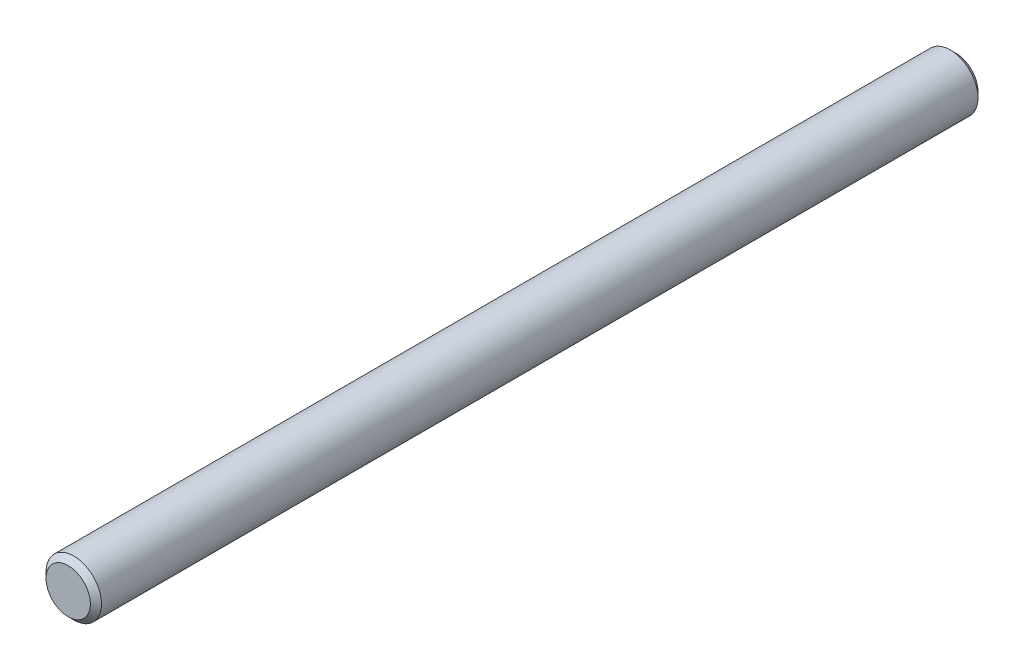
ISO-10303-21;
HEADER;
FILE_DESCRIPTION(('STEP AP214'),'2;1');
FILE_NAME('part.step','',(''),(''),'','','');
FILE_SCHEMA(('AUTOMOTIVE_DESIGN { 1 0 10303 214 1 1 1 1 }'));
ENDSEC;
DATA;
#1=APPLICATION_CONTEXT('core data for automotive mechanical design processes');
#2=APPLICATION_PROTOCOL_DEFINITION('international standard','automotive_design',2000,#1);
#3=PRODUCT_CONTEXT('',#1,'mechanical');
#4=PRODUCT('Part','Part','',(#3));
#5=PRODUCT_RELATED_PRODUCT_CATEGORY('part','',(#4));
#6=PRODUCT_DEFINITION_FORMATION('','',#4);
#7=PRODUCT_DEFINITION_CONTEXT('part definition',#1,'design');
#8=PRODUCT_DEFINITION('design','',#6,#7);
#9=PRODUCT_DEFINITION_SHAPE('','',#8);
#10=(LENGTH_UNIT() NAMED_UNIT(*) SI_UNIT(.MILLI.,.METRE.));
#11=(NAMED_UNIT(*) PLANE_ANGLE_UNIT() SI_UNIT($,.RADIAN.));
#12=(NAMED_UNIT(*) SI_UNIT($,.STERADIAN.) SOLID_ANGLE_UNIT());
#13=UNCERTAINTY_MEASURE_WITH_UNIT(LENGTH_MEASURE(1.E-05),#10,'distance_accuracy_value','');
#14=(GEOMETRIC_REPRESENTATION_CONTEXT(3) GLOBAL_UNCERTAINTY_ASSIGNED_CONTEXT((#13)) GLOBAL_UNIT_ASSIGNED_CONTEXT((#10,
#11,#12)) REPRESENTATION_CONTEXT('',''));
#15=CARTESIAN_POINT('',(0.,0.,0.));
#16=DIRECTION('',(0.,0.,1.));
#17=DIRECTION('',(1.,0.,0.));
#18=AXIS2_PLACEMENT_3D('',#15,#16,#17);
#19=CARTESIAN_POINT('',(0.,0.,80.));
#20=DIRECTION('',(0.,0.,-1.));
#21=DIRECTION('',(-1.,0.,0.));
#22=AXIS2_PLACEMENT_3D('',#19,#20,#21);
#23=CYLINDRICAL_SURFACE('',#22,2.5);
#24=CARTESIAN_POINT('',(0.,0.,79.5));
#25=DIRECTION('',(0.,0.,1.));
#26=DIRECTION('',(1.,0.,0.));
#27=AXIS2_PLACEMENT_3D('',#24,#25,#26);
#28=CIRCLE('',#27,2.5);
#29=CARTESIAN_POINT('',(2.5,0.,79.5));
#30=VERTEX_POINT('',#29);
#31=EDGE_CURVE('E43',#30,#30,#28,.F.);
#32=ORIENTED_EDGE('',*,*,#31,.T.);
#33=EDGE_LOOP('',(#32));
#34=FACE_BOUND('',#33,.T.);
#35=CARTESIAN_POINT('',(0.,0.,0.5));
#36=DIRECTION('',(0.,0.,1.));
#37=DIRECTION('',(1.,0.,0.));
#38=AXIS2_PLACEMENT_3D('',#35,#36,#37);
#39=CIRCLE('',#38,2.5);
#40=CARTESIAN_POINT('',(2.5,0.,0.5));
#41=VERTEX_POINT('',#40);
#42=EDGE_CURVE('E47',#41,#41,#39,.T.);
#43=ORIENTED_EDGE('',*,*,#42,.T.);
#44=EDGE_LOOP('',(#43));
#45=FACE_BOUND('',#44,.T.);
#46=ADVANCED_FACE('F35',(#34,#45),#23,.T.);
#47=CARTESIAN_POINT('',(0.,0.,80.));
#48=DIRECTION('',(0.,0.,1.));
#49=DIRECTION('',(1.,0.,0.));
#50=AXIS2_PLACEMENT_3D('',#47,#48,#49);
#51=PLANE('',#50);
#52=CARTESIAN_POINT('',(0.,0.,80.));
#53=DIRECTION('',(0.,0.,1.));
#54=DIRECTION('',(1.,0.,0.));
#55=AXIS2_PLACEMENT_3D('',#52,#53,#54);
#56=CIRCLE('',#55,1.99999999999999);
#57=CARTESIAN_POINT('',(1.99999999999999,0.,80.));
#58=VERTEX_POINT('',#57);
#59=EDGE_CURVE('E51',#58,#58,#56,.T.);
#60=ORIENTED_EDGE('',*,*,#59,.T.);
#61=EDGE_LOOP('',(#60));
#62=FACE_BOUND('',#61,.T.);
#63=ADVANCED_FACE('F57',(#62),#51,.T.);
#64=CARTESIAN_POINT('',(0.,0.,0.));
#65=DIRECTION('',(0.,0.,1.));
#66=DIRECTION('',(1.,0.,0.));
#67=AXIS2_PLACEMENT_3D('',#64,#65,#66);
#68=PLANE('',#67);
#69=CARTESIAN_POINT('',(0.,0.,0.));
#70=DIRECTION('',(0.,0.,1.));
#71=DIRECTION('',(1.,0.,0.));
#72=AXIS2_PLACEMENT_3D('',#69,#70,#71);
#73=CIRCLE('',#72,1.99999999999999);
#74=CARTESIAN_POINT('',(1.99999999999999,0.,0.));
#75=VERTEX_POINT('',#74);
#76=EDGE_CURVE('E10',#75,#75,#73,.F.);
#77=ORIENTED_EDGE('',*,*,#76,.T.);
#78=EDGE_LOOP('',(#77));
#79=FACE_BOUND('',#78,.T.);
#80=ADVANCED_FACE('F61',(#79),#68,.F.);
#81=CARTESIAN_POINT('',(0.,0.,80.));
#82=DIRECTION('',(0.,0.,-1.));
#83=DIRECTION('',(-1.,0.,0.));
#84=AXIS2_PLACEMENT_3D('',#81,#82,#83);
#85=CONICAL_SURFACE('',#84,1.99999999999999,0.785398163397467);
#86=ORIENTED_EDGE('',*,*,#31,.F.);
#87=EDGE_LOOP('',(#86));
#88=FACE_BOUND('',#87,.T.);
#89=ORIENTED_EDGE('',*,*,#59,.F.);
#90=EDGE_LOOP('',(#89));
#91=FACE_BOUND('',#90,.T.);
#92=ADVANCED_FACE('F59',(#88,#91),#85,.T.);
#93=CARTESIAN_POINT('',(0.,0.,0.5));
#94=DIRECTION('',(0.,0.,1.));
#95=DIRECTION('',(1.,0.,0.));
#96=AXIS2_PLACEMENT_3D('',#93,#94,#95);
#97=CONICAL_SURFACE('',#96,2.5,0.785398163397453);
#98=ORIENTED_EDGE('',*,*,#76,.F.);
#99=EDGE_LOOP('',(#98));
#100=FACE_BOUND('',#99,.T.);
#101=ORIENTED_EDGE('',*,*,#42,.F.);
#102=EDGE_LOOP('',(#101));
#103=FACE_BOUND('',#102,.T.);
#104=ADVANCED_FACE('F38',(#100,#103),#97,.T.);
#105=CLOSED_SHELL('',(#46,#63,#80,#92,#104));
#106=MANIFOLD_SOLID_BREP('B2',#105);
#107=ADVANCED_BREP_SHAPE_REPRESENTATION('',(#18,#106),#14);
#108=SHAPE_DEFINITION_REPRESENTATION(#9,#107);
ENDSEC;
END-ISO-10303-21;
